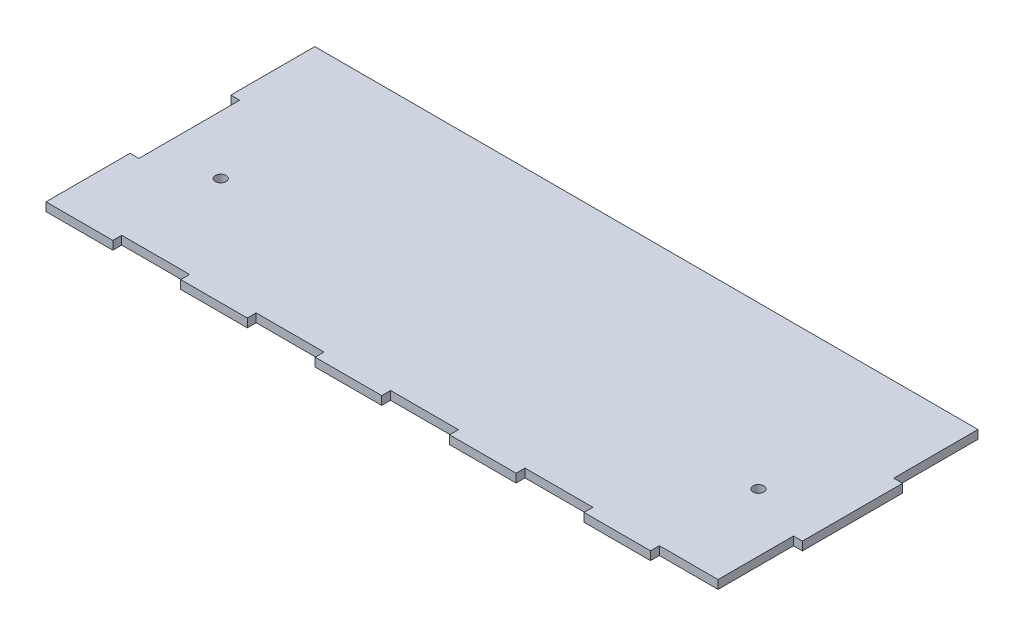
ISO-10303-21;
HEADER;
FILE_DESCRIPTION(('STEP AP214'),'2;1');
FILE_NAME('part.step','',(''),(''),'','','');
FILE_SCHEMA(('AUTOMOTIVE_DESIGN { 1 0 10303 214 1 1 1 1 }'));
ENDSEC;
DATA;
#1=APPLICATION_CONTEXT('core data for automotive mechanical design processes');
#2=APPLICATION_PROTOCOL_DEFINITION('international standard','automotive_design',2000,#1);
#3=PRODUCT_CONTEXT('',#1,'mechanical');
#4=PRODUCT('Part','Part','',(#3));
#5=PRODUCT_RELATED_PRODUCT_CATEGORY('part','',(#4));
#6=PRODUCT_DEFINITION_FORMATION('','',#4);
#7=PRODUCT_DEFINITION_CONTEXT('part definition',#1,'design');
#8=PRODUCT_DEFINITION('design','',#6,#7);
#9=PRODUCT_DEFINITION_SHAPE('','',#8);
#10=(LENGTH_UNIT() NAMED_UNIT(*) SI_UNIT(.MILLI.,.METRE.));
#11=(NAMED_UNIT(*) PLANE_ANGLE_UNIT() SI_UNIT($,.RADIAN.));
#12=(NAMED_UNIT(*) SI_UNIT($,.STERADIAN.) SOLID_ANGLE_UNIT());
#13=UNCERTAINTY_MEASURE_WITH_UNIT(LENGTH_MEASURE(1.E-05),#10,'distance_accuracy_value','');
#14=(GEOMETRIC_REPRESENTATION_CONTEXT(3) GLOBAL_UNCERTAINTY_ASSIGNED_CONTEXT((#13)) GLOBAL_UNIT_ASSIGNED_CONTEXT((#10,
#11,#12)) REPRESENTATION_CONTEXT('',''));
#15=CARTESIAN_POINT('',(0.,0.,0.));
#16=DIRECTION('',(0.,0.,1.));
#17=DIRECTION('',(1.,0.,0.));
#18=AXIS2_PLACEMENT_3D('',#15,#16,#17);
#19=CARTESIAN_POINT('',(-250.,3.175,100.));
#20=DIRECTION('',(1.,0.,0.));
#21=DIRECTION('',(0.,0.,-1.));
#22=AXIS2_PLACEMENT_3D('',#19,#20,#21);
#23=PLANE('',#22);
#24=DIRECTION('',(0.,0.,1.));
#25=VECTOR('',#24,1.);
#26=CARTESIAN_POINT('',(-250.,-3.175,100.));
#27=LINE('',#26,#25);
#28=CARTESIAN_POINT('',(-250.,-3.175,-100.));
#29=VERTEX_POINT('',#28);
#30=CARTESIAN_POINT('',(-250.,-3.175,-37.5));
#31=VERTEX_POINT('',#30);
#32=EDGE_CURVE('E251',#29,#31,#27,.T.);
#33=ORIENTED_EDGE('',*,*,#32,.T.);
#34=DIRECTION('',(0.,1.,0.));
#35=VECTOR('',#34,1.);
#36=CARTESIAN_POINT('',(-250.,-3.175,-37.5));
#37=LINE('',#36,#35);
#38=CARTESIAN_POINT('',(-250.,3.175,-37.5));
#39=VERTEX_POINT('',#38);
#40=EDGE_CURVE('E275',#31,#39,#37,.T.);
#41=ORIENTED_EDGE('',*,*,#40,.T.);
#42=DIRECTION('',(0.,0.,1.));
#43=VECTOR('',#42,1.);
#44=CARTESIAN_POINT('',(-250.,3.175,100.));
#45=LINE('',#44,#43);
#46=CARTESIAN_POINT('',(-250.,3.175,-100.));
#47=VERTEX_POINT('',#46);
#48=EDGE_CURVE('E274',#47,#39,#45,.T.);
#49=ORIENTED_EDGE('',*,*,#48,.F.);
#50=DIRECTION('',(0.,-1.,0.));
#51=VECTOR('',#50,1.);
#52=CARTESIAN_POINT('',(-250.,3.175,-100.));
#53=LINE('',#52,#51);
#54=EDGE_CURVE('E40',#47,#29,#53,.T.);
#55=ORIENTED_EDGE('',*,*,#54,.T.);
#56=EDGE_LOOP('',(#33,#41,#49,#55));
#57=FACE_BOUND('',#56,.T.);
#58=ADVANCED_FACE('F32',(#57),#23,.F.);
#59=CARTESIAN_POINT('',(-250.,3.175,100.));
#60=DIRECTION('',(0.,0.,-1.));
#61=DIRECTION('',(-1.,0.,0.));
#62=AXIS2_PLACEMENT_3D('',#59,#60,#61);
#63=PLANE('',#62);
#64=DIRECTION('',(1.,0.,0.));
#65=VECTOR('',#64,1.);
#66=CARTESIAN_POINT('',(-250.,-3.175,100.));
#67=LINE('',#66,#65);
#68=CARTESIAN_POINT('',(-149.75,-3.175,100.));
#69=VERTEX_POINT('',#68);
#70=CARTESIAN_POINT('',(-100.25,-3.175,100.));
#71=VERTEX_POINT('',#70);
#72=EDGE_CURVE('E266',#69,#71,#67,.T.);
#73=ORIENTED_EDGE('',*,*,#72,.T.);
#74=DIRECTION('',(0.,1.,0.));
#75=VECTOR('',#74,1.);
#76=CARTESIAN_POINT('',(-100.25,-3.175,100.));
#77=LINE('',#76,#75);
#78=CARTESIAN_POINT('',(-100.25,3.175,100.));
#79=VERTEX_POINT('',#78);
#80=EDGE_CURVE('E431',#71,#79,#77,.T.);
#81=ORIENTED_EDGE('',*,*,#80,.T.);
#82=DIRECTION('',(1.,0.,0.));
#83=VECTOR('',#82,1.);
#84=CARTESIAN_POINT('',(-250.,3.175,100.));
#85=LINE('',#84,#83);
#86=CARTESIAN_POINT('',(-149.75,3.175,100.));
#87=VERTEX_POINT('',#86);
#88=EDGE_CURVE('E286',#87,#79,#85,.T.);
#89=ORIENTED_EDGE('',*,*,#88,.F.);
#90=DIRECTION('',(0.,1.,0.));
#91=VECTOR('',#90,1.);
#92=CARTESIAN_POINT('',(-149.75,-3.175,100.));
#93=LINE('',#92,#91);
#94=EDGE_CURVE('E366',#69,#87,#93,.T.);
#95=ORIENTED_EDGE('',*,*,#94,.F.);
#96=EDGE_LOOP('',(#73,#81,#89,#95));
#97=FACE_BOUND('',#96,.T.);
#98=ADVANCED_FACE('F522',(#97),#63,.F.);
#99=CARTESIAN_POINT('',(-49.7499999999999,3.175,100.));
#100=VERTEX_POINT('',#99);
#101=CARTESIAN_POINT('',(-0.249999999999861,3.175,100.));
#102=VERTEX_POINT('',#101);
#103=EDGE_CURVE('E290',#100,#102,#85,.T.);
#104=ORIENTED_EDGE('',*,*,#103,.F.);
#105=DIRECTION('',(0.,1.,0.));
#106=VECTOR('',#105,1.);
#107=CARTESIAN_POINT('',(-49.7499999999999,-3.175,100.));
#108=LINE('',#107,#106);
#109=CARTESIAN_POINT('',(-49.7499999999999,-3.175,100.));
#110=VERTEX_POINT('',#109);
#111=EDGE_CURVE('E443',#110,#100,#108,.T.);
#112=ORIENTED_EDGE('',*,*,#111,.F.);
#113=CARTESIAN_POINT('',(-0.249999999999861,-3.175,100.));
#114=VERTEX_POINT('',#113);
#115=EDGE_CURVE('E573',#110,#114,#67,.T.);
#116=ORIENTED_EDGE('',*,*,#115,.T.);
#117=DIRECTION('',(0.,1.,0.));
#118=VECTOR('',#117,1.);
#119=CARTESIAN_POINT('',(-0.249999999999861,-3.175,100.));
#120=LINE('',#119,#118);
#121=EDGE_CURVE('E457',#114,#102,#120,.T.);
#122=ORIENTED_EDGE('',*,*,#121,.T.);
#123=EDGE_LOOP('',(#104,#112,#116,#122));
#124=FACE_BOUND('',#123,.T.);
#125=ADVANCED_FACE('F528',(#124),#63,.F.);
#126=CARTESIAN_POINT('',(50.2500000000001,3.175,100.));
#127=VERTEX_POINT('',#126);
#128=CARTESIAN_POINT('',(99.7500000000002,3.175,100.));
#129=VERTEX_POINT('',#128);
#130=EDGE_CURVE('E282',#127,#129,#85,.T.);
#131=ORIENTED_EDGE('',*,*,#130,.F.);
#132=DIRECTION('',(0.,1.,0.));
#133=VECTOR('',#132,1.);
#134=CARTESIAN_POINT('',(50.2500000000001,-3.175,100.));
#135=LINE('',#134,#133);
#136=CARTESIAN_POINT('',(50.2500000000001,-3.175,100.));
#137=VERTEX_POINT('',#136);
#138=EDGE_CURVE('E313',#137,#127,#135,.T.);
#139=ORIENTED_EDGE('',*,*,#138,.F.);
#140=CARTESIAN_POINT('',(99.7500000000002,-3.175,100.));
#141=VERTEX_POINT('',#140);
#142=EDGE_CURVE('E316',#137,#141,#67,.T.);
#143=ORIENTED_EDGE('',*,*,#142,.T.);
#144=DIRECTION('',(0.,1.,0.));
#145=VECTOR('',#144,1.);
#146=CARTESIAN_POINT('',(99.7500000000002,-3.175,100.));
#147=LINE('',#146,#145);
#148=EDGE_CURVE('E315',#141,#129,#147,.T.);
#149=ORIENTED_EDGE('',*,*,#148,.T.);
#150=EDGE_LOOP('',(#131,#139,#143,#149));
#151=FACE_BOUND('',#150,.T.);
#152=ADVANCED_FACE('F311',(#151),#63,.F.);
#153=CARTESIAN_POINT('',(-250.,-3.175,100.));
#154=VERTEX_POINT('',#153);
#155=CARTESIAN_POINT('',(-200.25,-3.175,100.));
#156=VERTEX_POINT('',#155);
#157=EDGE_CURVE('E262',#154,#156,#67,.T.);
#158=ORIENTED_EDGE('',*,*,#157,.T.);
#159=DIRECTION('',(0.,1.,0.));
#160=VECTOR('',#159,1.);
#161=CARTESIAN_POINT('',(-200.25,-3.175,100.));
#162=LINE('',#161,#160);
#163=CARTESIAN_POINT('',(-200.25,3.175,100.));
#164=VERTEX_POINT('',#163);
#165=EDGE_CURVE('E354',#156,#164,#162,.T.);
#166=ORIENTED_EDGE('',*,*,#165,.T.);
#167=CARTESIAN_POINT('',(-250.,3.175,100.));
#168=VERTEX_POINT('',#167);
#169=EDGE_CURVE('E269',#168,#164,#85,.T.);
#170=ORIENTED_EDGE('',*,*,#169,.F.);
#171=DIRECTION('',(0.,-1.,0.));
#172=VECTOR('',#171,1.);
#173=CARTESIAN_POINT('',(-250.,3.175,100.));
#174=LINE('',#173,#172);
#175=EDGE_CURVE('E267',#168,#154,#174,.T.);
#176=ORIENTED_EDGE('',*,*,#175,.T.);
#177=EDGE_LOOP('',(#158,#166,#170,#176));
#178=FACE_BOUND('',#177,.T.);
#179=ADVANCED_FACE('F537',(#178),#63,.F.);
#180=CARTESIAN_POINT('',(250.,3.175,100.));
#181=DIRECTION('',(-1.,0.,0.));
#182=DIRECTION('',(0.,0.,1.));
#183=AXIS2_PLACEMENT_3D('',#180,#181,#182);
#184=PLANE('',#183);
#185=DIRECTION('',(0.,0.,-1.));
#186=VECTOR('',#185,1.);
#187=CARTESIAN_POINT('',(250.,-3.175,100.));
#188=LINE('',#187,#186);
#189=CARTESIAN_POINT('',(250.,-3.175,37.25));
#190=VERTEX_POINT('',#189);
#191=CARTESIAN_POINT('',(250.,-3.175,-37.25));
#192=VERTEX_POINT('',#191);
#193=EDGE_CURVE('E253',#190,#192,#188,.T.);
#194=ORIENTED_EDGE('',*,*,#193,.T.);
#195=DIRECTION('',(0.,1.,0.));
#196=VECTOR('',#195,1.);
#197=CARTESIAN_POINT('',(250.,-3.175,-37.25));
#198=LINE('',#197,#196);
#199=CARTESIAN_POINT('',(250.,3.175,-37.25));
#200=VERTEX_POINT('',#199);
#201=EDGE_CURVE('E380',#192,#200,#198,.T.);
#202=ORIENTED_EDGE('',*,*,#201,.T.);
#203=DIRECTION('',(0.,0.,-1.));
#204=VECTOR('',#203,1.);
#205=CARTESIAN_POINT('',(250.,3.175,100.));
#206=LINE('',#205,#204);
#207=CARTESIAN_POINT('',(250.,3.175,37.25));
#208=VERTEX_POINT('',#207);
#209=EDGE_CURVE('E265',#208,#200,#206,.T.);
#210=ORIENTED_EDGE('',*,*,#209,.F.);
#211=DIRECTION('',(0.,1.,0.));
#212=VECTOR('',#211,1.);
#213=CARTESIAN_POINT('',(250.,-3.175,37.25));
#214=LINE('',#213,#212);
#215=EDGE_CURVE('E412',#190,#208,#214,.T.);
#216=ORIENTED_EDGE('',*,*,#215,.F.);
#217=EDGE_LOOP('',(#194,#202,#210,#216));
#218=FACE_BOUND('',#217,.T.);
#219=ADVANCED_FACE('F34',(#218),#184,.F.);
#220=CARTESIAN_POINT('',(-250.,3.175,-100.));
#221=DIRECTION('',(0.,0.,1.));
#222=DIRECTION('',(1.,0.,0.));
#223=AXIS2_PLACEMENT_3D('',#220,#221,#222);
#224=PLANE('',#223);
#225=DIRECTION('',(-1.,0.,0.));
#226=VECTOR('',#225,1.);
#227=CARTESIAN_POINT('',(-250.,3.175,-100.));
#228=LINE('',#227,#226);
#229=CARTESIAN_POINT('',(243.4,3.175,-100.));
#230=VERTEX_POINT('',#229);
#231=EDGE_CURVE('E245',#230,#47,#228,.T.);
#232=ORIENTED_EDGE('',*,*,#231,.F.);
#233=DIRECTION('',(0.,1.,0.));
#234=VECTOR('',#233,1.);
#235=CARTESIAN_POINT('',(243.4,-3.175,-100.));
#236=LINE('',#235,#234);
#237=CARTESIAN_POINT('',(243.4,-3.175,-100.));
#238=VERTEX_POINT('',#237);
#239=EDGE_CURVE('E232',#238,#230,#236,.T.);
#240=ORIENTED_EDGE('',*,*,#239,.F.);
#241=DIRECTION('',(-1.,0.,0.));
#242=VECTOR('',#241,1.);
#243=CARTESIAN_POINT('',(-250.,-3.175,-100.));
#244=LINE('',#243,#242);
#245=EDGE_CURVE('E243',#238,#29,#244,.T.);
#246=ORIENTED_EDGE('',*,*,#245,.T.);
#247=ORIENTED_EDGE('',*,*,#54,.F.);
#248=EDGE_LOOP('',(#232,#240,#246,#247));
#249=FACE_BOUND('',#248,.T.);
#250=ADVANCED_FACE('F241',(#249),#224,.F.);
#251=CARTESIAN_POINT('',(-250.,3.175,37.5));
#252=VERTEX_POINT('',#251);
#253=EDGE_CURVE('E279',#252,#168,#45,.T.);
#254=ORIENTED_EDGE('',*,*,#253,.F.);
#255=DIRECTION('',(0.,1.,0.));
#256=VECTOR('',#255,1.);
#257=CARTESIAN_POINT('',(-250.,-3.175,37.5));
#258=LINE('',#257,#256);
#259=CARTESIAN_POINT('',(-250.,-3.175,37.5));
#260=VERTEX_POINT('',#259);
#261=EDGE_CURVE('E392',#260,#252,#258,.T.);
#262=ORIENTED_EDGE('',*,*,#261,.F.);
#263=EDGE_CURVE('E252',#260,#154,#27,.T.);
#264=ORIENTED_EDGE('',*,*,#263,.T.);
#265=ORIENTED_EDGE('',*,*,#175,.F.);
#266=EDGE_LOOP('',(#254,#262,#264,#265));
#267=FACE_BOUND('',#266,.T.);
#268=ADVANCED_FACE('F524',(#267),#23,.F.);
#269=CARTESIAN_POINT('',(150.25,3.175,100.));
#270=VERTEX_POINT('',#269);
#271=CARTESIAN_POINT('',(199.75,3.175,100.));
#272=VERTEX_POINT('',#271);
#273=EDGE_CURVE('E278',#270,#272,#85,.T.);
#274=ORIENTED_EDGE('',*,*,#273,.F.);
#275=DIRECTION('',(0.,1.,0.));
#276=VECTOR('',#275,1.);
#277=CARTESIAN_POINT('',(150.25,-3.175,100.));
#278=LINE('',#277,#276);
#279=CARTESIAN_POINT('',(150.25,-3.175,100.));
#280=VERTEX_POINT('',#279);
#281=EDGE_CURVE('E320',#280,#270,#278,.T.);
#282=ORIENTED_EDGE('',*,*,#281,.F.);
#283=CARTESIAN_POINT('',(199.75,-3.175,100.));
#284=VERTEX_POINT('',#283);
#285=EDGE_CURVE('E261',#280,#284,#67,.T.);
#286=ORIENTED_EDGE('',*,*,#285,.T.);
#287=DIRECTION('',(0.,1.,0.));
#288=VECTOR('',#287,1.);
#289=CARTESIAN_POINT('',(199.75,-3.175,100.));
#290=LINE('',#289,#288);
#291=EDGE_CURVE('E333',#284,#272,#290,.T.);
#292=ORIENTED_EDGE('',*,*,#291,.T.);
#293=EDGE_LOOP('',(#274,#282,#286,#292));
#294=FACE_BOUND('',#293,.T.);
#295=ADVANCED_FACE('F491',(#294),#63,.F.);
#296=CARTESIAN_POINT('',(0.,3.175,0.));
#297=DIRECTION('',(0.,-1.,0.));
#298=DIRECTION('',(0.,0.,-1.));
#299=AXIS2_PLACEMENT_3D('',#296,#297,#298);
#300=PLANE('',#299);
#301=CARTESIAN_POINT('',(-200.,3.175,20.));
#302=DIRECTION('',(0.,1.,0.));
#303=DIRECTION('',(0.,0.,1.));
#304=AXIS2_PLACEMENT_3D('',#301,#302,#303);
#305=CIRCLE('',#304,3.99999999999999);
#306=CARTESIAN_POINT('',(-200.,3.175,24.));
#307=VERTEX_POINT('',#306);
#308=EDGE_CURVE('E624',#307,#307,#305,.T.);
#309=ORIENTED_EDGE('',*,*,#308,.F.);
#310=EDGE_LOOP('',(#309));
#311=FACE_BOUND('',#310,.T.);
#312=CARTESIAN_POINT('',(200.,3.175,20.));
#313=DIRECTION('',(0.,1.,0.));
#314=DIRECTION('',(0.,0.,1.));
#315=AXIS2_PLACEMENT_3D('',#312,#313,#314);
#316=CIRCLE('',#315,3.99999999999999);
#317=CARTESIAN_POINT('',(200.,3.175,24.));
#318=VERTEX_POINT('',#317);
#319=EDGE_CURVE('E625',#318,#318,#316,.T.);
#320=ORIENTED_EDGE('',*,*,#319,.F.);
#321=EDGE_LOOP('',(#320));
#322=FACE_BOUND('',#321,.T.);
#323=ORIENTED_EDGE('',*,*,#48,.T.);
#324=DIRECTION('',(-1.,0.,0.));
#325=VECTOR('',#324,1.);
#326=CARTESIAN_POINT('',(-250.,3.175,-37.5));
#327=LINE('',#326,#325);
#328=CARTESIAN_POINT('',(-243.4,3.175,-37.5));
#329=VERTEX_POINT('',#328);
#330=EDGE_CURVE('E388',#329,#39,#327,.T.);
#331=ORIENTED_EDGE('',*,*,#330,.F.);
#332=DIRECTION('',(0.,0.,-1.));
#333=VECTOR('',#332,1.);
#334=CARTESIAN_POINT('',(-243.4,3.175,37.5));
#335=LINE('',#334,#333);
#336=CARTESIAN_POINT('',(-243.4,3.175,37.5));
#337=VERTEX_POINT('',#336);
#338=EDGE_CURVE('E396',#337,#329,#335,.T.);
#339=ORIENTED_EDGE('',*,*,#338,.F.);
#340=DIRECTION('',(1.,0.,0.));
#341=VECTOR('',#340,1.);
#342=CARTESIAN_POINT('',(-250.,3.175,37.5));
#343=LINE('',#342,#341);
#344=EDGE_CURVE('E393',#252,#337,#343,.T.);
#345=ORIENTED_EDGE('',*,*,#344,.F.);
#346=ORIENTED_EDGE('',*,*,#253,.T.);
#347=ORIENTED_EDGE('',*,*,#169,.T.);
#348=DIRECTION('',(0.,0.,1.));
#349=VECTOR('',#348,1.);
#350=CARTESIAN_POINT('',(-200.25,3.175,100.));
#351=LINE('',#350,#349);
#352=CARTESIAN_POINT('',(-200.25,3.175,93.4));
#353=VERTEX_POINT('',#352);
#354=EDGE_CURVE('E355',#353,#164,#351,.T.);
#355=ORIENTED_EDGE('',*,*,#354,.F.);
#356=DIRECTION('',(-1.,0.,0.));
#357=VECTOR('',#356,1.);
#358=CARTESIAN_POINT('',(-200.25,3.175,93.4));
#359=LINE('',#358,#357);
#360=CARTESIAN_POINT('',(-149.75,3.175,93.4));
#361=VERTEX_POINT('',#360);
#362=EDGE_CURVE('E348',#361,#353,#359,.T.);
#363=ORIENTED_EDGE('',*,*,#362,.F.);
#364=DIRECTION('',(0.,0.,-1.));
#365=VECTOR('',#364,1.);
#366=CARTESIAN_POINT('',(-149.75,3.175,100.));
#367=LINE('',#366,#365);
#368=EDGE_CURVE('E357',#87,#361,#367,.T.);
#369=ORIENTED_EDGE('',*,*,#368,.F.);
#370=ORIENTED_EDGE('',*,*,#88,.T.);
#371=DIRECTION('',(0.,0.,1.));
#372=VECTOR('',#371,1.);
#373=CARTESIAN_POINT('',(-100.25,3.175,100.));
#374=LINE('',#373,#372);
#375=CARTESIAN_POINT('',(-100.25,3.175,93.4));
#376=VERTEX_POINT('',#375);
#377=EDGE_CURVE('E432',#376,#79,#374,.T.);
#378=ORIENTED_EDGE('',*,*,#377,.F.);
#379=DIRECTION('',(-1.,0.,0.));
#380=VECTOR('',#379,1.);
#381=CARTESIAN_POINT('',(-100.25,3.175,93.4));
#382=LINE('',#381,#380);
#383=CARTESIAN_POINT('',(-49.7499999999999,3.175,93.4));
#384=VERTEX_POINT('',#383);
#385=EDGE_CURVE('E425',#384,#376,#382,.T.);
#386=ORIENTED_EDGE('',*,*,#385,.F.);
#387=DIRECTION('',(0.,0.,-1.));
#388=VECTOR('',#387,1.);
#389=CARTESIAN_POINT('',(-49.7499999999999,3.175,100.));
#390=LINE('',#389,#388);
#391=EDGE_CURVE('E434',#100,#384,#390,.T.);
#392=ORIENTED_EDGE('',*,*,#391,.F.);
#393=ORIENTED_EDGE('',*,*,#103,.T.);
#394=DIRECTION('',(0.,0.,1.));
#395=VECTOR('',#394,1.);
#396=CARTESIAN_POINT('',(-0.249999999999861,3.175,100.));
#397=LINE('',#396,#395);
#398=CARTESIAN_POINT('',(-0.249999999999861,3.175,93.4));
#399=VERTEX_POINT('',#398);
#400=EDGE_CURVE('E458',#399,#102,#397,.T.);
#401=ORIENTED_EDGE('',*,*,#400,.F.);
#402=DIRECTION('',(-1.,0.,0.));
#403=VECTOR('',#402,1.);
#404=CARTESIAN_POINT('',(-0.249999999999861,3.175,93.4));
#405=LINE('',#404,#403);
#406=CARTESIAN_POINT('',(50.2500000000001,3.175,93.4));
#407=VERTEX_POINT('',#406);
#408=EDGE_CURVE('E451',#407,#399,#405,.T.);
#409=ORIENTED_EDGE('',*,*,#408,.F.);
#410=DIRECTION('',(0.,0.,-1.));
#411=VECTOR('',#410,1.);
#412=CARTESIAN_POINT('',(50.2500000000001,3.175,100.));
#413=LINE('',#412,#411);
#414=EDGE_CURVE('E307',#127,#407,#413,.T.);
#415=ORIENTED_EDGE('',*,*,#414,.F.);
#416=ORIENTED_EDGE('',*,*,#130,.T.);
#417=DIRECTION('',(0.,0.,1.));
#418=VECTOR('',#417,1.);
#419=CARTESIAN_POINT('',(99.7500000000002,3.175,100.));
#420=LINE('',#419,#418);
#421=CARTESIAN_POINT('',(99.7500000000002,3.175,93.4));
#422=VERTEX_POINT('',#421);
#423=EDGE_CURVE('E304',#422,#129,#420,.T.);
#424=ORIENTED_EDGE('',*,*,#423,.F.);
#425=DIRECTION('',(-1.,0.,0.));
#426=VECTOR('',#425,1.);
#427=CARTESIAN_POINT('',(99.7500000000002,3.175,93.4));
#428=LINE('',#427,#426);
#429=CARTESIAN_POINT('',(150.25,3.175,93.4));
#430=VERTEX_POINT('',#429);
#431=EDGE_CURVE('E472',#430,#422,#428,.T.);
#432=ORIENTED_EDGE('',*,*,#431,.F.);
#433=DIRECTION('',(0.,0.,-1.));
#434=VECTOR('',#433,1.);
#435=CARTESIAN_POINT('',(150.25,3.175,100.));
#436=LINE('',#435,#434);
#437=EDGE_CURVE('E476',#270,#430,#436,.T.);
#438=ORIENTED_EDGE('',*,*,#437,.F.);
#439=ORIENTED_EDGE('',*,*,#273,.T.);
#440=DIRECTION('',(0.,0.,1.));
#441=VECTOR('',#440,1.);
#442=CARTESIAN_POINT('',(199.75,3.175,100.));
#443=LINE('',#442,#441);
#444=CARTESIAN_POINT('',(199.75,3.175,93.4));
#445=VERTEX_POINT('',#444);
#446=EDGE_CURVE('E335',#445,#272,#443,.T.);
#447=ORIENTED_EDGE('',*,*,#446,.F.);
#448=DIRECTION('',(-1.,0.,0.));
#449=VECTOR('',#448,1.);
#450=CARTESIAN_POINT('',(199.75,3.175,93.4));
#451=LINE('',#450,#449);
#452=CARTESIAN_POINT('',(243.4,3.175,93.4));
#453=VERTEX_POINT('',#452);
#454=EDGE_CURVE('E334',#453,#445,#451,.T.);
#455=ORIENTED_EDGE('',*,*,#454,.F.);
#456=DIRECTION('',(0.,0.,1.));
#457=VECTOR('',#456,1.);
#458=CARTESIAN_POINT('',(243.4,3.175,93.3999999999999));
#459=LINE('',#458,#457);
#460=CARTESIAN_POINT('',(243.4,3.175,37.25));
#461=VERTEX_POINT('',#460);
#462=EDGE_CURVE('E409',#461,#453,#459,.T.);
#463=ORIENTED_EDGE('',*,*,#462,.F.);
#464=DIRECTION('',(-1.,0.,0.));
#465=VECTOR('',#464,1.);
#466=CARTESIAN_POINT('',(250.,3.175,37.25));
#467=LINE('',#466,#465);
#468=EDGE_CURVE('E383',#208,#461,#467,.T.);
#469=ORIENTED_EDGE('',*,*,#468,.F.);
#470=ORIENTED_EDGE('',*,*,#209,.T.);
#471=DIRECTION('',(1.,0.,0.));
#472=VECTOR('',#471,1.);
#473=CARTESIAN_POINT('',(250.,3.175,-37.25));
#474=LINE('',#473,#472);
#475=CARTESIAN_POINT('',(243.4,3.175,-37.25));
#476=VERTEX_POINT('',#475);
#477=EDGE_CURVE('E237',#476,#200,#474,.T.);
#478=ORIENTED_EDGE('',*,*,#477,.F.);
#479=DIRECTION('',(0.,0.,1.));
#480=VECTOR('',#479,1.);
#481=CARTESIAN_POINT('',(243.4,3.175,-100.));
#482=LINE('',#481,#480);
#483=EDGE_CURVE('E373',#230,#476,#482,.T.);
#484=ORIENTED_EDGE('',*,*,#483,.F.);
#485=ORIENTED_EDGE('',*,*,#231,.T.);
#486=EDGE_LOOP('',(#323,#331,#339,#345,#346,#347,#355,#363,#369,#370,#378,#386,#392,#393,#401,
#409,#415,#416,#424,#432,#438,#439,#447,#455,#463,#469,#470,#478,#484,#485));
#487=FACE_BOUND('',#486,.T.);
#488=ADVANCED_FACE('F302',(#311,#322,#487),#300,.F.);
#489=CARTESIAN_POINT('',(0.,-3.175,0.));
#490=DIRECTION('',(0.,-1.,0.));
#491=DIRECTION('',(0.,0.,-1.));
#492=AXIS2_PLACEMENT_3D('',#489,#490,#491);
#493=PLANE('',#492);
#494=CARTESIAN_POINT('',(-200.,-3.175,20.));
#495=DIRECTION('',(0.,1.,0.));
#496=DIRECTION('',(0.,0.,1.));
#497=AXIS2_PLACEMENT_3D('',#494,#495,#496);
#498=CIRCLE('',#497,3.99999999999999);
#499=CARTESIAN_POINT('',(-200.,-3.175,24.));
#500=VERTEX_POINT('',#499);
#501=EDGE_CURVE('E397',#500,#500,#498,.T.);
#502=ORIENTED_EDGE('',*,*,#501,.T.);
#503=EDGE_LOOP('',(#502));
#504=FACE_BOUND('',#503,.T.);
#505=CARTESIAN_POINT('',(200.,-3.175,20.));
#506=DIRECTION('',(0.,1.,0.));
#507=DIRECTION('',(0.,0.,1.));
#508=AXIS2_PLACEMENT_3D('',#505,#506,#507);
#509=CIRCLE('',#508,3.99999999999999);
#510=CARTESIAN_POINT('',(200.,-3.175,24.));
#511=VERTEX_POINT('',#510);
#512=EDGE_CURVE('E622',#511,#511,#509,.T.);
#513=ORIENTED_EDGE('',*,*,#512,.T.);
#514=EDGE_LOOP('',(#513));
#515=FACE_BOUND('',#514,.T.);
#516=DIRECTION('',(-1.,0.,0.));
#517=VECTOR('',#516,1.);
#518=CARTESIAN_POINT('',(-250.,-3.175,-37.5));
#519=LINE('',#518,#517);
#520=CARTESIAN_POINT('',(-243.4,-3.175,-37.5));
#521=VERTEX_POINT('',#520);
#522=EDGE_CURVE('E390',#521,#31,#519,.T.);
#523=ORIENTED_EDGE('',*,*,#522,.T.);
#524=ORIENTED_EDGE('',*,*,#32,.F.);
#525=ORIENTED_EDGE('',*,*,#245,.F.);
#526=DIRECTION('',(0.,0.,1.));
#527=VECTOR('',#526,1.);
#528=CARTESIAN_POINT('',(243.4,-3.175,-100.));
#529=LINE('',#528,#527);
#530=CARTESIAN_POINT('',(243.4,-3.175,-37.25));
#531=VERTEX_POINT('',#530);
#532=EDGE_CURVE('E228',#238,#531,#529,.T.);
#533=ORIENTED_EDGE('',*,*,#532,.T.);
#534=DIRECTION('',(1.,0.,0.));
#535=VECTOR('',#534,1.);
#536=CARTESIAN_POINT('',(250.,-3.175,-37.25));
#537=LINE('',#536,#535);
#538=EDGE_CURVE('E55',#531,#192,#537,.T.);
#539=ORIENTED_EDGE('',*,*,#538,.T.);
#540=ORIENTED_EDGE('',*,*,#193,.F.);
#541=DIRECTION('',(-1.,0.,0.));
#542=VECTOR('',#541,1.);
#543=CARTESIAN_POINT('',(250.,-3.175,37.25));
#544=LINE('',#543,#542);
#545=CARTESIAN_POINT('',(243.4,-3.175,37.25));
#546=VERTEX_POINT('',#545);
#547=EDGE_CURVE('E405',#190,#546,#544,.T.);
#548=ORIENTED_EDGE('',*,*,#547,.T.);
#549=DIRECTION('',(0.,0.,1.));
#550=VECTOR('',#549,1.);
#551=CARTESIAN_POINT('',(243.4,-3.175,93.3999999999999));
#552=LINE('',#551,#550);
#553=CARTESIAN_POINT('',(243.4,-3.175,93.3999999999999));
#554=VERTEX_POINT('',#553);
#555=EDGE_CURVE('E408',#546,#554,#552,.T.);
#556=ORIENTED_EDGE('',*,*,#555,.T.);
#557=DIRECTION('',(1.,0.,0.));
#558=VECTOR('',#557,1.);
#559=CARTESIAN_POINT('',(0.,-3.175,93.4));
#560=LINE('',#559,#558);
#561=CARTESIAN_POINT('',(199.75,-3.175,93.4));
#562=VERTEX_POINT('',#561);
#563=EDGE_CURVE('E11',#562,#554,#560,.T.);
#564=ORIENTED_EDGE('',*,*,#563,.F.);
#565=DIRECTION('',(0.,0.,1.));
#566=VECTOR('',#565,1.);
#567=CARTESIAN_POINT('',(199.75,-3.175,100.));
#568=LINE('',#567,#566);
#569=EDGE_CURVE('E330',#562,#284,#568,.T.);
#570=ORIENTED_EDGE('',*,*,#569,.T.);
#571=ORIENTED_EDGE('',*,*,#285,.F.);
#572=DIRECTION('',(0.,0.,-1.));
#573=VECTOR('',#572,1.);
#574=CARTESIAN_POINT('',(150.25,-3.175,100.));
#575=LINE('',#574,#573);
#576=CARTESIAN_POINT('',(150.25,-3.175,93.4));
#577=VERTEX_POINT('',#576);
#578=EDGE_CURVE('E326',#280,#577,#575,.T.);
#579=ORIENTED_EDGE('',*,*,#578,.T.);
#580=DIRECTION('',(-1.,0.,0.));
#581=VECTOR('',#580,1.);
#582=CARTESIAN_POINT('',(99.7500000000002,-3.175,93.4));
#583=LINE('',#582,#581);
#584=CARTESIAN_POINT('',(99.7500000000002,-3.175,93.4));
#585=VERTEX_POINT('',#584);
#586=EDGE_CURVE('E321',#577,#585,#583,.T.);
#587=ORIENTED_EDGE('',*,*,#586,.T.);
#588=DIRECTION('',(0.,0.,1.));
#589=VECTOR('',#588,1.);
#590=CARTESIAN_POINT('',(99.7500000000002,-3.175,100.));
#591=LINE('',#590,#589);
#592=EDGE_CURVE('E470',#585,#141,#591,.T.);
#593=ORIENTED_EDGE('',*,*,#592,.T.);
#594=ORIENTED_EDGE('',*,*,#142,.F.);
#595=DIRECTION('',(0.,0.,-1.));
#596=VECTOR('',#595,1.);
#597=CARTESIAN_POINT('',(50.2500000000001,-3.175,100.));
#598=LINE('',#597,#596);
#599=CARTESIAN_POINT('',(50.2500000000001,-3.175,93.4));
#600=VERTEX_POINT('',#599);
#601=EDGE_CURVE('E450',#137,#600,#598,.T.);
#602=ORIENTED_EDGE('',*,*,#601,.T.);
#603=DIRECTION('',(-1.,0.,0.));
#604=VECTOR('',#603,1.);
#605=CARTESIAN_POINT('',(-0.249999999999861,-3.175,93.4));
#606=LINE('',#605,#604);
#607=CARTESIAN_POINT('',(-0.249999999999861,-3.175,93.4));
#608=VERTEX_POINT('',#607);
#609=EDGE_CURVE('E454',#600,#608,#606,.T.);
#610=ORIENTED_EDGE('',*,*,#609,.T.);
#611=DIRECTION('',(0.,0.,1.));
#612=VECTOR('',#611,1.);
#613=CARTESIAN_POINT('',(-0.249999999999861,-3.175,100.));
#614=LINE('',#613,#612);
#615=EDGE_CURVE('E447',#608,#114,#614,.T.);
#616=ORIENTED_EDGE('',*,*,#615,.T.);
#617=ORIENTED_EDGE('',*,*,#115,.F.);
#618=DIRECTION('',(0.,0.,-1.));
#619=VECTOR('',#618,1.);
#620=CARTESIAN_POINT('',(-49.7499999999999,-3.175,100.));
#621=LINE('',#620,#619);
#622=CARTESIAN_POINT('',(-49.7499999999999,-3.175,93.4));
#623=VERTEX_POINT('',#622);
#624=EDGE_CURVE('E424',#110,#623,#621,.T.);
#625=ORIENTED_EDGE('',*,*,#624,.T.);
#626=DIRECTION('',(-1.,0.,0.));
#627=VECTOR('',#626,1.);
#628=CARTESIAN_POINT('',(-100.25,-3.175,93.4));
#629=LINE('',#628,#627);
#630=CARTESIAN_POINT('',(-100.25,-3.175,93.4));
#631=VERTEX_POINT('',#630);
#632=EDGE_CURVE('E428',#623,#631,#629,.T.);
#633=ORIENTED_EDGE('',*,*,#632,.T.);
#634=DIRECTION('',(0.,0.,1.));
#635=VECTOR('',#634,1.);
#636=CARTESIAN_POINT('',(-100.25,-3.175,100.));
#637=LINE('',#636,#635);
#638=EDGE_CURVE('E421',#631,#71,#637,.T.);
#639=ORIENTED_EDGE('',*,*,#638,.T.);
#640=ORIENTED_EDGE('',*,*,#72,.F.);
#641=DIRECTION('',(0.,0.,-1.));
#642=VECTOR('',#641,1.);
#643=CARTESIAN_POINT('',(-149.75,-3.175,100.));
#644=LINE('',#643,#642);
#645=CARTESIAN_POINT('',(-149.75,-3.175,93.4));
#646=VERTEX_POINT('',#645);
#647=EDGE_CURVE('E347',#69,#646,#644,.T.);
#648=ORIENTED_EDGE('',*,*,#647,.T.);
#649=DIRECTION('',(-1.,0.,0.));
#650=VECTOR('',#649,1.);
#651=CARTESIAN_POINT('',(-200.25,-3.175,93.4));
#652=LINE('',#651,#650);
#653=CARTESIAN_POINT('',(-200.25,-3.175,93.4));
#654=VERTEX_POINT('',#653);
#655=EDGE_CURVE('E351',#646,#654,#652,.T.);
#656=ORIENTED_EDGE('',*,*,#655,.T.);
#657=DIRECTION('',(0.,0.,1.));
#658=VECTOR('',#657,1.);
#659=CARTESIAN_POINT('',(-200.25,-3.175,100.));
#660=LINE('',#659,#658);
#661=EDGE_CURVE('E344',#654,#156,#660,.T.);
#662=ORIENTED_EDGE('',*,*,#661,.T.);
#663=ORIENTED_EDGE('',*,*,#157,.F.);
#664=ORIENTED_EDGE('',*,*,#263,.F.);
#665=DIRECTION('',(1.,0.,0.));
#666=VECTOR('',#665,1.);
#667=CARTESIAN_POINT('',(-250.,-3.175,37.5));
#668=LINE('',#667,#666);
#669=CARTESIAN_POINT('',(-243.4,-3.175,37.5));
#670=VERTEX_POINT('',#669);
#671=EDGE_CURVE('E385',#260,#670,#668,.T.);
#672=ORIENTED_EDGE('',*,*,#671,.T.);
#673=DIRECTION('',(0.,0.,-1.));
#674=VECTOR('',#673,1.);
#675=CARTESIAN_POINT('',(-243.4,-3.175,37.5));
#676=LINE('',#675,#674);
#677=EDGE_CURVE('E47',#670,#521,#676,.T.);
#678=ORIENTED_EDGE('',*,*,#677,.T.);
#679=EDGE_LOOP('',(#523,#524,#525,#533,#539,#540,#548,#556,#564,#570,#571,#579,#587,#593,#594,
#602,#610,#616,#617,#625,#633,#639,#640,#648,#656,#662,#663,#664,#672,#678));
#680=FACE_BOUND('',#679,.T.);
#681=ADVANCED_FACE('F249',(#504,#515,#680),#493,.T.);
#682=CARTESIAN_POINT('',(-200.25,-3.175,100.));
#683=DIRECTION('',(-1.,0.,0.));
#684=DIRECTION('',(0.,0.,1.));
#685=AXIS2_PLACEMENT_3D('',#682,#683,#684);
#686=PLANE('',#685);
#687=ORIENTED_EDGE('',*,*,#354,.T.);
#688=ORIENTED_EDGE('',*,*,#165,.F.);
#689=ORIENTED_EDGE('',*,*,#661,.F.);
#690=DIRECTION('',(0.,1.,0.));
#691=VECTOR('',#690,1.);
#692=CARTESIAN_POINT('',(-200.25,-3.175,93.4));
#693=LINE('',#692,#691);
#694=EDGE_CURVE('E257',#654,#353,#693,.T.);
#695=ORIENTED_EDGE('',*,*,#694,.T.);
#696=EDGE_LOOP('',(#687,#688,#689,#695));
#697=FACE_BOUND('',#696,.T.);
#698=ADVANCED_FACE('F550',(#697),#686,.F.);
#699=CARTESIAN_POINT('',(-200.25,-3.175,93.4));
#700=DIRECTION('',(0.,0.,-1.));
#701=DIRECTION('',(-1.,0.,0.));
#702=AXIS2_PLACEMENT_3D('',#699,#700,#701);
#703=PLANE('',#702);
#704=ORIENTED_EDGE('',*,*,#362,.T.);
#705=ORIENTED_EDGE('',*,*,#694,.F.);
#706=ORIENTED_EDGE('',*,*,#655,.F.);
#707=DIRECTION('',(0.,1.,0.));
#708=VECTOR('',#707,1.);
#709=CARTESIAN_POINT('',(-149.75,-3.175,93.4));
#710=LINE('',#709,#708);
#711=EDGE_CURVE('E364',#646,#361,#710,.T.);
#712=ORIENTED_EDGE('',*,*,#711,.T.);
#713=EDGE_LOOP('',(#704,#705,#706,#712));
#714=FACE_BOUND('',#713,.T.);
#715=ADVANCED_FACE('F554',(#714),#703,.F.);
#716=CARTESIAN_POINT('',(-149.75,-3.175,100.));
#717=DIRECTION('',(1.,0.,0.));
#718=DIRECTION('',(0.,0.,-1.));
#719=AXIS2_PLACEMENT_3D('',#716,#717,#718);
#720=PLANE('',#719);
#721=ORIENTED_EDGE('',*,*,#368,.T.);
#722=ORIENTED_EDGE('',*,*,#711,.F.);
#723=ORIENTED_EDGE('',*,*,#647,.F.);
#724=ORIENTED_EDGE('',*,*,#94,.T.);
#725=EDGE_LOOP('',(#721,#722,#723,#724));
#726=FACE_BOUND('',#725,.T.);
#727=ADVANCED_FACE('F556',(#726),#720,.F.);
#728=CARTESIAN_POINT('',(199.75,-3.175,93.4));
#729=DIRECTION('',(0.,0.,-1.));
#730=DIRECTION('',(-1.,0.,0.));
#731=AXIS2_PLACEMENT_3D('',#728,#729,#730);
#732=PLANE('',#731);
#733=ORIENTED_EDGE('',*,*,#563,.T.);
#734=DIRECTION('',(0.,1.,0.));
#735=VECTOR('',#734,1.);
#736=CARTESIAN_POINT('',(243.4,-3.175,93.3999999999999));
#737=LINE('',#736,#735);
#738=EDGE_CURVE('E337',#554,#453,#737,.T.);
#739=ORIENTED_EDGE('',*,*,#738,.T.);
#740=ORIENTED_EDGE('',*,*,#454,.T.);
#741=DIRECTION('',(0.,1.,0.));
#742=VECTOR('',#741,1.);
#743=CARTESIAN_POINT('',(199.75,-3.175,93.4));
#744=LINE('',#743,#742);
#745=EDGE_CURVE('E339',#562,#445,#744,.T.);
#746=ORIENTED_EDGE('',*,*,#745,.F.);
#747=EDGE_LOOP('',(#733,#739,#740,#746));
#748=FACE_BOUND('',#747,.T.);
#749=ADVANCED_FACE('F500',(#748),#732,.F.);
#750=CARTESIAN_POINT('',(199.75,-3.175,100.));
#751=DIRECTION('',(-1.,0.,0.));
#752=DIRECTION('',(0.,0.,1.));
#753=AXIS2_PLACEMENT_3D('',#750,#751,#752);
#754=PLANE('',#753);
#755=ORIENTED_EDGE('',*,*,#446,.T.);
#756=ORIENTED_EDGE('',*,*,#291,.F.);
#757=ORIENTED_EDGE('',*,*,#569,.F.);
#758=ORIENTED_EDGE('',*,*,#745,.T.);
#759=EDGE_LOOP('',(#755,#756,#757,#758));
#760=FACE_BOUND('',#759,.T.);
#761=ADVANCED_FACE('F495',(#760),#754,.F.);
#762=CARTESIAN_POINT('',(99.7500000000002,-3.175,100.));
#763=DIRECTION('',(-1.,0.,0.));
#764=DIRECTION('',(0.,0.,1.));
#765=AXIS2_PLACEMENT_3D('',#762,#763,#764);
#766=PLANE('',#765);
#767=ORIENTED_EDGE('',*,*,#423,.T.);
#768=ORIENTED_EDGE('',*,*,#148,.F.);
#769=ORIENTED_EDGE('',*,*,#592,.F.);
#770=DIRECTION('',(0.,1.,0.));
#771=VECTOR('',#770,1.);
#772=CARTESIAN_POINT('',(99.7500000000002,-3.175,93.4));
#773=LINE('',#772,#771);
#774=EDGE_CURVE('E460',#585,#422,#773,.T.);
#775=ORIENTED_EDGE('',*,*,#774,.T.);
#776=EDGE_LOOP('',(#767,#768,#769,#775));
#777=FACE_BOUND('',#776,.T.);
#778=ADVANCED_FACE('F595',(#777),#766,.F.);
#779=CARTESIAN_POINT('',(99.7500000000002,-3.175,93.4));
#780=DIRECTION('',(0.,0.,-1.));
#781=DIRECTION('',(-1.,0.,0.));
#782=AXIS2_PLACEMENT_3D('',#779,#780,#781);
#783=PLANE('',#782);
#784=ORIENTED_EDGE('',*,*,#431,.T.);
#785=ORIENTED_EDGE('',*,*,#774,.F.);
#786=ORIENTED_EDGE('',*,*,#586,.F.);
#787=DIRECTION('',(0.,1.,0.));
#788=VECTOR('',#787,1.);
#789=CARTESIAN_POINT('',(150.25,-3.175,93.4));
#790=LINE('',#789,#788);
#791=EDGE_CURVE('E323',#577,#430,#790,.T.);
#792=ORIENTED_EDGE('',*,*,#791,.T.);
#793=EDGE_LOOP('',(#784,#785,#786,#792));
#794=FACE_BOUND('',#793,.T.);
#795=ADVANCED_FACE('F483',(#794),#783,.F.);
#796=CARTESIAN_POINT('',(150.25,-3.175,100.));
#797=DIRECTION('',(1.,0.,0.));
#798=DIRECTION('',(0.,0.,-1.));
#799=AXIS2_PLACEMENT_3D('',#796,#797,#798);
#800=PLANE('',#799);
#801=ORIENTED_EDGE('',*,*,#437,.T.);
#802=ORIENTED_EDGE('',*,*,#791,.F.);
#803=ORIENTED_EDGE('',*,*,#578,.F.);
#804=ORIENTED_EDGE('',*,*,#281,.T.);
#805=EDGE_LOOP('',(#801,#802,#803,#804));
#806=FACE_BOUND('',#805,.T.);
#807=ADVANCED_FACE('F486',(#806),#800,.F.);
#808=CARTESIAN_POINT('',(-0.249999999999861,-3.175,100.));
#809=DIRECTION('',(-1.,0.,0.));
#810=DIRECTION('',(0.,0.,1.));
#811=AXIS2_PLACEMENT_3D('',#808,#809,#810);
#812=PLANE('',#811);
#813=ORIENTED_EDGE('',*,*,#400,.T.);
#814=ORIENTED_EDGE('',*,*,#121,.F.);
#815=ORIENTED_EDGE('',*,*,#615,.F.);
#816=DIRECTION('',(0.,1.,0.));
#817=VECTOR('',#816,1.);
#818=CARTESIAN_POINT('',(-0.249999999999861,-3.175,93.4));
#819=LINE('',#818,#817);
#820=EDGE_CURVE('E435',#608,#399,#819,.T.);
#821=ORIENTED_EDGE('',*,*,#820,.T.);
#822=EDGE_LOOP('',(#813,#814,#815,#821));
#823=FACE_BOUND('',#822,.T.);
#824=ADVANCED_FACE('F576',(#823),#812,.F.);
#825=CARTESIAN_POINT('',(-0.249999999999861,-3.175,93.4));
#826=DIRECTION('',(0.,0.,-1.));
#827=DIRECTION('',(-1.,0.,0.));
#828=AXIS2_PLACEMENT_3D('',#825,#826,#827);
#829=PLANE('',#828);
#830=ORIENTED_EDGE('',*,*,#408,.T.);
#831=ORIENTED_EDGE('',*,*,#820,.F.);
#832=ORIENTED_EDGE('',*,*,#609,.F.);
#833=DIRECTION('',(0.,1.,0.));
#834=VECTOR('',#833,1.);
#835=CARTESIAN_POINT('',(50.2500000000001,-3.175,93.4));
#836=LINE('',#835,#834);
#837=EDGE_CURVE('E465',#600,#407,#836,.T.);
#838=ORIENTED_EDGE('',*,*,#837,.T.);
#839=EDGE_LOOP('',(#830,#831,#832,#838));
#840=FACE_BOUND('',#839,.T.);
#841=ADVANCED_FACE('F579',(#840),#829,.F.);
#842=CARTESIAN_POINT('',(50.2500000000001,-3.175,100.));
#843=DIRECTION('',(1.,0.,0.));
#844=DIRECTION('',(0.,0.,-1.));
#845=AXIS2_PLACEMENT_3D('',#842,#843,#844);
#846=PLANE('',#845);
#847=ORIENTED_EDGE('',*,*,#414,.T.);
#848=ORIENTED_EDGE('',*,*,#837,.F.);
#849=ORIENTED_EDGE('',*,*,#601,.F.);
#850=ORIENTED_EDGE('',*,*,#138,.T.);
#851=EDGE_LOOP('',(#847,#848,#849,#850));
#852=FACE_BOUND('',#851,.T.);
#853=ADVANCED_FACE('F581',(#852),#846,.F.);
#854=CARTESIAN_POINT('',(-100.25,-3.175,100.));
#855=DIRECTION('',(-1.,0.,0.));
#856=DIRECTION('',(0.,0.,1.));
#857=AXIS2_PLACEMENT_3D('',#854,#855,#856);
#858=PLANE('',#857);
#859=ORIENTED_EDGE('',*,*,#377,.T.);
#860=ORIENTED_EDGE('',*,*,#80,.F.);
#861=ORIENTED_EDGE('',*,*,#638,.F.);
#862=DIRECTION('',(0.,1.,0.));
#863=VECTOR('',#862,1.);
#864=CARTESIAN_POINT('',(-100.25,-3.175,93.4));
#865=LINE('',#864,#863);
#866=EDGE_CURVE('E358',#631,#376,#865,.T.);
#867=ORIENTED_EDGE('',*,*,#866,.T.);
#868=EDGE_LOOP('',(#859,#860,#861,#867));
#869=FACE_BOUND('',#868,.T.);
#870=ADVANCED_FACE('F562',(#869),#858,.F.);
#871=CARTESIAN_POINT('',(-100.25,-3.175,93.4));
#872=DIRECTION('',(0.,0.,-1.));
#873=DIRECTION('',(-1.,0.,0.));
#874=AXIS2_PLACEMENT_3D('',#871,#872,#873);
#875=PLANE('',#874);
#876=ORIENTED_EDGE('',*,*,#385,.T.);
#877=ORIENTED_EDGE('',*,*,#866,.F.);
#878=ORIENTED_EDGE('',*,*,#632,.F.);
#879=DIRECTION('',(0.,1.,0.));
#880=VECTOR('',#879,1.);
#881=CARTESIAN_POINT('',(-49.7499999999999,-3.175,93.4));
#882=LINE('',#881,#880);
#883=EDGE_CURVE('E441',#623,#384,#882,.T.);
#884=ORIENTED_EDGE('',*,*,#883,.T.);
#885=EDGE_LOOP('',(#876,#877,#878,#884));
#886=FACE_BOUND('',#885,.T.);
#887=ADVANCED_FACE('F566',(#886),#875,.F.);
#888=CARTESIAN_POINT('',(-49.7499999999999,-3.175,100.));
#889=DIRECTION('',(1.,0.,0.));
#890=DIRECTION('',(0.,0.,-1.));
#891=AXIS2_PLACEMENT_3D('',#888,#889,#890);
#892=PLANE('',#891);
#893=ORIENTED_EDGE('',*,*,#391,.T.);
#894=ORIENTED_EDGE('',*,*,#883,.F.);
#895=ORIENTED_EDGE('',*,*,#624,.F.);
#896=ORIENTED_EDGE('',*,*,#111,.T.);
#897=EDGE_LOOP('',(#893,#894,#895,#896));
#898=FACE_BOUND('',#897,.T.);
#899=ADVANCED_FACE('F568',(#898),#892,.F.);
#900=CARTESIAN_POINT('',(243.4,-3.175,93.3999999999999));
#901=DIRECTION('',(-1.,0.,0.));
#902=DIRECTION('',(0.,0.,1.));
#903=AXIS2_PLACEMENT_3D('',#900,#901,#902);
#904=PLANE('',#903);
#905=ORIENTED_EDGE('',*,*,#462,.T.);
#906=ORIENTED_EDGE('',*,*,#738,.F.);
#907=ORIENTED_EDGE('',*,*,#555,.F.);
#908=DIRECTION('',(0.,1.,0.));
#909=VECTOR('',#908,1.);
#910=CARTESIAN_POINT('',(243.4,-3.175,37.25));
#911=LINE('',#910,#909);
#912=EDGE_CURVE('E418',#546,#461,#911,.T.);
#913=ORIENTED_EDGE('',*,*,#912,.T.);
#914=EDGE_LOOP('',(#905,#906,#907,#913));
#915=FACE_BOUND('',#914,.T.);
#916=ADVANCED_FACE('F504',(#915),#904,.F.);
#917=CARTESIAN_POINT('',(250.,-3.175,37.25));
#918=DIRECTION('',(0.,0.,-1.));
#919=DIRECTION('',(-1.,0.,0.));
#920=AXIS2_PLACEMENT_3D('',#917,#918,#919);
#921=PLANE('',#920);
#922=ORIENTED_EDGE('',*,*,#468,.T.);
#923=ORIENTED_EDGE('',*,*,#912,.F.);
#924=ORIENTED_EDGE('',*,*,#547,.F.);
#925=ORIENTED_EDGE('',*,*,#215,.T.);
#926=EDGE_LOOP('',(#922,#923,#924,#925));
#927=FACE_BOUND('',#926,.T.);
#928=ADVANCED_FACE('F506',(#927),#921,.F.);
#929=CARTESIAN_POINT('',(250.,-3.175,-37.25));
#930=DIRECTION('',(0.,0.,1.));
#931=DIRECTION('',(1.,0.,0.));
#932=AXIS2_PLACEMENT_3D('',#929,#930,#931);
#933=PLANE('',#932);
#934=ORIENTED_EDGE('',*,*,#477,.T.);
#935=ORIENTED_EDGE('',*,*,#201,.F.);
#936=ORIENTED_EDGE('',*,*,#538,.F.);
#937=DIRECTION('',(0.,1.,0.));
#938=VECTOR('',#937,1.);
#939=CARTESIAN_POINT('',(243.4,-3.175,-37.25));
#940=LINE('',#939,#938);
#941=EDGE_CURVE('E234',#531,#476,#940,.T.);
#942=ORIENTED_EDGE('',*,*,#941,.T.);
#943=EDGE_LOOP('',(#934,#935,#936,#942));
#944=FACE_BOUND('',#943,.T.);
#945=ADVANCED_FACE('F510',(#944),#933,.F.);
#946=CARTESIAN_POINT('',(243.4,-3.175,-100.));
#947=DIRECTION('',(-1.,0.,0.));
#948=DIRECTION('',(0.,0.,1.));
#949=AXIS2_PLACEMENT_3D('',#946,#947,#948);
#950=PLANE('',#949);
#951=ORIENTED_EDGE('',*,*,#483,.T.);
#952=ORIENTED_EDGE('',*,*,#941,.F.);
#953=ORIENTED_EDGE('',*,*,#532,.F.);
#954=ORIENTED_EDGE('',*,*,#239,.T.);
#955=EDGE_LOOP('',(#951,#952,#953,#954));
#956=FACE_BOUND('',#955,.T.);
#957=ADVANCED_FACE('F231',(#956),#950,.F.);
#958=CARTESIAN_POINT('',(-250.,-3.175,-37.5));
#959=DIRECTION('',(0.,0.,-1.));
#960=DIRECTION('',(-1.,0.,0.));
#961=AXIS2_PLACEMENT_3D('',#958,#959,#960);
#962=PLANE('',#961);
#963=ORIENTED_EDGE('',*,*,#330,.T.);
#964=ORIENTED_EDGE('',*,*,#40,.F.);
#965=ORIENTED_EDGE('',*,*,#522,.F.);
#966=DIRECTION('',(0.,1.,0.));
#967=VECTOR('',#966,1.);
#968=CARTESIAN_POINT('',(-243.4,-3.175,-37.5));
#969=LINE('',#968,#967);
#970=EDGE_CURVE('E376',#521,#329,#969,.T.);
#971=ORIENTED_EDGE('',*,*,#970,.T.);
#972=EDGE_LOOP('',(#963,#964,#965,#971));
#973=FACE_BOUND('',#972,.T.);
#974=ADVANCED_FACE('F517',(#973),#962,.F.);
#975=CARTESIAN_POINT('',(-243.4,-3.175,37.5));
#976=DIRECTION('',(1.,0.,0.));
#977=DIRECTION('',(0.,0.,-1.));
#978=AXIS2_PLACEMENT_3D('',#975,#976,#977);
#979=PLANE('',#978);
#980=ORIENTED_EDGE('',*,*,#338,.T.);
#981=ORIENTED_EDGE('',*,*,#970,.F.);
#982=ORIENTED_EDGE('',*,*,#677,.F.);
#983=DIRECTION('',(0.,1.,0.));
#984=VECTOR('',#983,1.);
#985=CARTESIAN_POINT('',(-243.4,-3.175,37.5));
#986=LINE('',#985,#984);
#987=EDGE_CURVE('E402',#670,#337,#986,.T.);
#988=ORIENTED_EDGE('',*,*,#987,.T.);
#989=EDGE_LOOP('',(#980,#981,#982,#988));
#990=FACE_BOUND('',#989,.T.);
#991=ADVANCED_FACE('F644',(#990),#979,.F.);
#992=CARTESIAN_POINT('',(-250.,-3.175,37.5));
#993=DIRECTION('',(0.,0.,1.));
#994=DIRECTION('',(1.,0.,0.));
#995=AXIS2_PLACEMENT_3D('',#992,#993,#994);
#996=PLANE('',#995);
#997=ORIENTED_EDGE('',*,*,#344,.T.);
#998=ORIENTED_EDGE('',*,*,#987,.F.);
#999=ORIENTED_EDGE('',*,*,#671,.F.);
#1000=ORIENTED_EDGE('',*,*,#261,.T.);
#1001=EDGE_LOOP('',(#997,#998,#999,#1000));
#1002=FACE_BOUND('',#1001,.T.);
#1003=ADVANCED_FACE('F545',(#1002),#996,.F.);
#1004=CARTESIAN_POINT('',(200.,-3.175,20.));
#1005=DIRECTION('',(0.,1.,0.));
#1006=DIRECTION('',(0.,0.,1.));
#1007=AXIS2_PLACEMENT_3D('',#1004,#1005,#1006);
#1008=CYLINDRICAL_SURFACE('',#1007,3.99999999999999);
#1009=ORIENTED_EDGE('',*,*,#512,.F.);
#1010=EDGE_LOOP('',(#1009));
#1011=FACE_BOUND('',#1010,.T.);
#1012=ORIENTED_EDGE('',*,*,#319,.T.);
#1013=EDGE_LOOP('',(#1012));
#1014=FACE_BOUND('',#1013,.T.);
#1015=ADVANCED_FACE('F634',(#1011,#1014),#1008,.F.);
#1016=CARTESIAN_POINT('',(-200.,-3.175,20.));
#1017=DIRECTION('',(0.,1.,0.));
#1018=DIRECTION('',(0.,0.,1.));
#1019=AXIS2_PLACEMENT_3D('',#1016,#1017,#1018);
#1020=CYLINDRICAL_SURFACE('',#1019,3.99999999999999);
#1021=ORIENTED_EDGE('',*,*,#501,.F.);
#1022=EDGE_LOOP('',(#1021));
#1023=FACE_BOUND('',#1022,.T.);
#1024=ORIENTED_EDGE('',*,*,#308,.T.);
#1025=EDGE_LOOP('',(#1024));
#1026=FACE_BOUND('',#1025,.T.);
#1027=ADVANCED_FACE('F637',(#1023,#1026),#1020,.F.);
#1028=CLOSED_SHELL('',(#58,#98,#125,#152,#179,#219,#250,#268,#295,#488,#681,#698,#715,#727,#749,
#761,#778,#795,#807,#824,#841,#853,#870,#887,#899,#916,#928,#945,#957,#974,#991,#1003,#1015,#1027));
#1029=MANIFOLD_SOLID_BREP('B2',#1028);
#1030=ADVANCED_BREP_SHAPE_REPRESENTATION('',(#18,#1029),#14);
#1031=SHAPE_DEFINITION_REPRESENTATION(#9,#1030);
ENDSEC;
END-ISO-10303-21;
